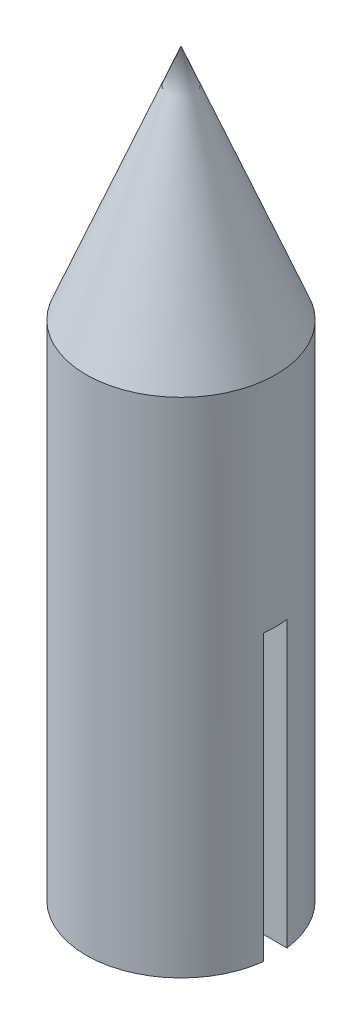
ISO-10303-21;
HEADER;
FILE_DESCRIPTION(('STEP AP214'),'2;1');
FILE_NAME('part.step','',(''),(''),'','','');
FILE_SCHEMA(('AUTOMOTIVE_DESIGN { 1 0 10303 214 1 1 1 1 }'));
ENDSEC;
DATA;
#1=APPLICATION_CONTEXT('core data for automotive mechanical design processes');
#2=APPLICATION_PROTOCOL_DEFINITION('international standard','automotive_design',2000,#1);
#3=PRODUCT_CONTEXT('',#1,'mechanical');
#4=PRODUCT('Part','Part','',(#3));
#5=PRODUCT_RELATED_PRODUCT_CATEGORY('part','',(#4));
#6=PRODUCT_DEFINITION_FORMATION('','',#4);
#7=PRODUCT_DEFINITION_CONTEXT('part definition',#1,'design');
#8=PRODUCT_DEFINITION('design','',#6,#7);
#9=PRODUCT_DEFINITION_SHAPE('','',#8);
#10=(LENGTH_UNIT() NAMED_UNIT(*) SI_UNIT(.MILLI.,.METRE.));
#11=(NAMED_UNIT(*) PLANE_ANGLE_UNIT() SI_UNIT($,.RADIAN.));
#12=(NAMED_UNIT(*) SI_UNIT($,.STERADIAN.) SOLID_ANGLE_UNIT());
#13=UNCERTAINTY_MEASURE_WITH_UNIT(LENGTH_MEASURE(1.E-05),#10,'distance_accuracy_value','');
#14=(GEOMETRIC_REPRESENTATION_CONTEXT(3) GLOBAL_UNCERTAINTY_ASSIGNED_CONTEXT((#13)) GLOBAL_UNIT_ASSIGNED_CONTEXT((#10,
#11,#12)) REPRESENTATION_CONTEXT('',''));
#15=CARTESIAN_POINT('',(0.,0.,0.));
#16=DIRECTION('',(0.,0.,1.));
#17=DIRECTION('',(1.,0.,0.));
#18=AXIS2_PLACEMENT_3D('',#15,#16,#17);
#19=CARTESIAN_POINT('',(0.,0.,0.));
#20=DIRECTION('',(0.,1.,0.));
#21=DIRECTION('',(0.,0.,1.));
#22=AXIS2_PLACEMENT_3D('',#19,#20,#21);
#23=PLANE('',#22);
#24=CARTESIAN_POINT('',(0.,0.,0.));
#25=DIRECTION('',(0.,1.,0.));
#26=DIRECTION('',(0.,0.,1.));
#27=AXIS2_PLACEMENT_3D('',#24,#25,#26);
#28=CIRCLE('',#27,2.54);
#29=CARTESIAN_POINT('',(2.52007812378902,0.,-0.3175));
#30=VERTEX_POINT('',#29);
#31=CARTESIAN_POINT('',(-2.52007812378902,0.,-0.3175));
#32=VERTEX_POINT('',#31);
#33=EDGE_CURVE('E180',#30,#32,#28,.T.);
#34=ORIENTED_EDGE('',*,*,#33,.F.);
#35=DIRECTION('',(1.,0.,0.));
#36=VECTOR('',#35,1.);
#37=CARTESIAN_POINT('',(-2.54,0.,-0.3175));
#38=LINE('',#37,#36);
#39=CARTESIAN_POINT('',(1.22967221242086,0.,-0.3175));
#40=VERTEX_POINT('',#39);
#41=EDGE_CURVE('E213',#40,#30,#38,.T.);
#42=ORIENTED_EDGE('',*,*,#41,.F.);
#43=CARTESIAN_POINT('',(0.,0.,0.));
#44=DIRECTION('',(0.,1.,0.));
#45=DIRECTION('',(0.,0.,1.));
#46=AXIS2_PLACEMENT_3D('',#43,#44,#45);
#47=CIRCLE('',#46,1.27);
#48=CARTESIAN_POINT('',(-1.22967221242086,0.,-0.3175));
#49=VERTEX_POINT('',#48);
#50=EDGE_CURVE('E176',#40,#49,#47,.T.);
#51=ORIENTED_EDGE('',*,*,#50,.T.);
#52=EDGE_CURVE('E126',#32,#49,#38,.T.);
#53=ORIENTED_EDGE('',*,*,#52,.F.);
#54=EDGE_LOOP('',(#34,#42,#51,#53));
#55=FACE_BOUND('',#54,.T.);
#56=ADVANCED_FACE('F47',(#55),#23,.F.);
#57=CARTESIAN_POINT('',(-2.52007812378902,0.,0.3175));
#58=VERTEX_POINT('',#57);
#59=CARTESIAN_POINT('',(2.52007812378902,0.,0.3175));
#60=VERTEX_POINT('',#59);
#61=EDGE_CURVE('E177',#58,#60,#28,.T.);
#62=ORIENTED_EDGE('',*,*,#61,.F.);
#63=DIRECTION('',(1.,0.,0.));
#64=VECTOR('',#63,1.);
#65=CARTESIAN_POINT('',(-2.54,0.,0.3175));
#66=LINE('',#65,#64);
#67=CARTESIAN_POINT('',(-1.22967221242085,0.,0.3175));
#68=VERTEX_POINT('',#67);
#69=EDGE_CURVE('E134',#58,#68,#66,.T.);
#70=ORIENTED_EDGE('',*,*,#69,.T.);
#71=CARTESIAN_POINT('',(1.22967221242085,0.,0.3175));
#72=VERTEX_POINT('',#71);
#73=EDGE_CURVE('E172',#68,#72,#47,.T.);
#74=ORIENTED_EDGE('',*,*,#73,.T.);
#75=EDGE_CURVE('E142',#72,#60,#66,.T.);
#76=ORIENTED_EDGE('',*,*,#75,.T.);
#77=EDGE_LOOP('',(#62,#70,#74,#76));
#78=FACE_BOUND('',#77,.T.);
#79=ADVANCED_FACE('F217',(#78),#23,.F.);
#80=CARTESIAN_POINT('',(0.,11.43,0.));
#81=DIRECTION('',(0.,-1.,0.));
#82=DIRECTION('',(0.,0.,-1.));
#83=AXIS2_PLACEMENT_3D('',#80,#81,#82);
#84=CYLINDRICAL_SURFACE('',#83,2.54);
#85=ORIENTED_EDGE('',*,*,#61,.T.);
#86=DIRECTION('',(0.,-1.,0.));
#87=VECTOR('',#86,1.);
#88=CARTESIAN_POINT('',(2.52007812378902,11.43,0.317500000000007));
#89=LINE('',#88,#87);
#90=CARTESIAN_POINT('',(2.52007812378902,7.62,0.317500000000005));
#91=VERTEX_POINT('',#90);
#92=EDGE_CURVE('E136',#60,#91,#89,.F.);
#93=ORIENTED_EDGE('',*,*,#92,.T.);
#94=CARTESIAN_POINT('',(0.,7.62,0.));
#95=DIRECTION('',(0.,1.,0.));
#96=DIRECTION('',(0.,0.,1.));
#97=AXIS2_PLACEMENT_3D('',#94,#95,#96);
#98=CIRCLE('',#97,2.54);
#99=CARTESIAN_POINT('',(2.52007812378902,7.62,-0.3175));
#100=VERTEX_POINT('',#99);
#101=EDGE_CURVE('E125',#91,#100,#98,.T.);
#102=ORIENTED_EDGE('',*,*,#101,.T.);
#103=DIRECTION('',(0.,-1.,0.));
#104=VECTOR('',#103,1.);
#105=CARTESIAN_POINT('',(2.52007812378902,11.43,-0.3175));
#106=LINE('',#105,#104);
#107=EDGE_CURVE('E160',#100,#30,#106,.T.);
#108=ORIENTED_EDGE('',*,*,#107,.T.);
#109=ORIENTED_EDGE('',*,*,#33,.T.);
#110=DIRECTION('',(0.,-1.,0.));
#111=VECTOR('',#110,1.);
#112=CARTESIAN_POINT('',(-2.52007812378902,11.43,-0.3175));
#113=LINE('',#112,#111);
#114=CARTESIAN_POINT('',(-2.52007812378902,7.62,-0.3175));
#115=VERTEX_POINT('',#114);
#116=EDGE_CURVE('E122',#32,#115,#113,.F.);
#117=ORIENTED_EDGE('',*,*,#116,.T.);
#118=CARTESIAN_POINT('',(-2.52007812378902,7.62,0.317500000000005));
#119=VERTEX_POINT('',#118);
#120=EDGE_CURVE('E115',#115,#119,#98,.T.);
#121=ORIENTED_EDGE('',*,*,#120,.T.);
#122=DIRECTION('',(0.,-1.,0.));
#123=VECTOR('',#122,1.);
#124=CARTESIAN_POINT('',(-2.52007812378902,11.43,0.317500000000007));
#125=LINE('',#124,#123);
#126=EDGE_CURVE('E119',#119,#58,#125,.T.);
#127=ORIENTED_EDGE('',*,*,#126,.T.);
#128=EDGE_LOOP('',(#85,#93,#102,#108,#109,#117,#121,#127));
#129=FACE_BOUND('',#128,.T.);
#130=CARTESIAN_POINT('',(0.,13.462,0.));
#131=DIRECTION('',(0.,1.,0.));
#132=DIRECTION('',(0.,0.,1.));
#133=AXIS2_PLACEMENT_3D('',#130,#131,#132);
#134=CIRCLE('',#133,2.54);
#135=CARTESIAN_POINT('',(0.,13.462,2.54));
#136=VERTEX_POINT('',#135);
#137=EDGE_CURVE('E164',#136,#136,#134,.T.);
#138=ORIENTED_EDGE('',*,*,#137,.F.);
#139=EDGE_LOOP('',(#138));
#140=FACE_BOUND('',#139,.T.);
#141=ADVANCED_FACE('F49',(#129,#140),#84,.T.);
#142=CARTESIAN_POINT('',(0.,11.43,0.));
#143=DIRECTION('',(0.,-1.,0.));
#144=DIRECTION('',(0.,0.,-1.));
#145=AXIS2_PLACEMENT_3D('',#142,#143,#144);
#146=CYLINDRICAL_SURFACE('',#145,1.27);
#147=DIRECTION('',(0.,-1.,0.));
#148=VECTOR('',#147,1.);
#149=CARTESIAN_POINT('',(1.22967221242086,11.43,-0.3175));
#150=LINE('',#149,#148);
#151=CARTESIAN_POINT('',(1.22967221242086,7.62,-0.3175));
#152=VERTEX_POINT('',#151);
#153=EDGE_CURVE('E11',#152,#40,#150,.T.);
#154=ORIENTED_EDGE('',*,*,#153,.F.);
#155=CARTESIAN_POINT('',(0.,7.62,0.));
#156=DIRECTION('',(0.,1.,0.));
#157=DIRECTION('',(0.,0.,1.));
#158=AXIS2_PLACEMENT_3D('',#155,#156,#157);
#159=CIRCLE('',#158,1.27);
#160=CARTESIAN_POINT('',(1.22967221242085,7.62,0.317500000000005));
#161=VERTEX_POINT('',#160);
#162=EDGE_CURVE('E184',#161,#152,#159,.T.);
#163=ORIENTED_EDGE('',*,*,#162,.F.);
#164=DIRECTION('',(0.,-1.,0.));
#165=VECTOR('',#164,1.);
#166=CARTESIAN_POINT('',(1.22967221242085,11.43,0.317500000000007));
#167=LINE('',#166,#165);
#168=EDGE_CURVE('E56',#72,#161,#167,.F.);
#169=ORIENTED_EDGE('',*,*,#168,.F.);
#170=ORIENTED_EDGE('',*,*,#73,.F.);
#171=DIRECTION('',(0.,-1.,0.));
#172=VECTOR('',#171,1.);
#173=CARTESIAN_POINT('',(-1.22967221242085,11.43,0.317500000000007));
#174=LINE('',#173,#172);
#175=CARTESIAN_POINT('',(-1.22967221242085,7.62,0.317500000000005));
#176=VERTEX_POINT('',#175);
#177=EDGE_CURVE('E183',#176,#68,#174,.T.);
#178=ORIENTED_EDGE('',*,*,#177,.F.);
#179=CARTESIAN_POINT('',(-1.22967221242086,7.62,-0.3175));
#180=VERTEX_POINT('',#179);
#181=EDGE_CURVE('E140',#180,#176,#159,.T.);
#182=ORIENTED_EDGE('',*,*,#181,.F.);
#183=DIRECTION('',(0.,-1.,0.));
#184=VECTOR('',#183,1.);
#185=CARTESIAN_POINT('',(-1.22967221242086,11.43,-0.3175));
#186=LINE('',#185,#184);
#187=EDGE_CURVE('E187',#49,#180,#186,.F.);
#188=ORIENTED_EDGE('',*,*,#187,.F.);
#189=ORIENTED_EDGE('',*,*,#50,.F.);
#190=EDGE_LOOP('',(#154,#163,#169,#170,#178,#182,#188,#189));
#191=FACE_BOUND('',#190,.T.);
#192=CARTESIAN_POINT('',(0.,11.43,0.));
#193=DIRECTION('',(0.,1.,0.));
#194=DIRECTION('',(0.,0.,1.));
#195=AXIS2_PLACEMENT_3D('',#192,#193,#194);
#196=CIRCLE('',#195,1.27);
#197=CARTESIAN_POINT('',(0.,11.43,1.27));
#198=VERTEX_POINT('',#197);
#199=EDGE_CURVE('E168',#198,#198,#196,.T.);
#200=ORIENTED_EDGE('',*,*,#199,.T.);
#201=EDGE_LOOP('',(#200));
#202=FACE_BOUND('',#201,.T.);
#203=ADVANCED_FACE('F203',(#191,#202),#146,.F.);
#204=CARTESIAN_POINT('',(0.,11.43,0.));
#205=DIRECTION('',(0.,1.,0.));
#206=DIRECTION('',(0.,0.,1.));
#207=AXIS2_PLACEMENT_3D('',#204,#205,#206);
#208=PLANE('',#207);
#209=ORIENTED_EDGE('',*,*,#199,.F.);
#210=EDGE_LOOP('',(#209));
#211=FACE_BOUND('',#210,.T.);
#212=ADVANCED_FACE('F238',(#211),#208,.F.);
#213=CARTESIAN_POINT('',(0.,19.812,0.));
#214=DIRECTION('',(0.,-1.,0.));
#215=DIRECTION('',(0.,0.,-1.));
#216=AXIS2_PLACEMENT_3D('',#213,#214,#215);
#217=CONICAL_SURFACE('',#216,0.,0.380506377112365);
#218=ORIENTED_EDGE('',*,*,#137,.T.);
#219=EDGE_LOOP('',(#218));
#220=FACE_BOUND('',#219,.T.);
#221=CARTESIAN_POINT('',(0.,19.812,0.));
#222=VERTEX_POINT('',#221);
#223=VERTEX_LOOP('',#222);
#224=FACE_BOUND('',#223,.T.);
#225=ADVANCED_FACE('F241',(#220,#224),#217,.T.);
#226=CARTESIAN_POINT('',(-2.54,7.62,-0.3175));
#227=DIRECTION('',(0.,1.,0.));
#228=DIRECTION('',(0.,0.,1.));
#229=AXIS2_PLACEMENT_3D('',#226,#227,#228);
#230=PLANE('',#229);
#231=DIRECTION('',(1.,0.,0.));
#232=VECTOR('',#231,1.);
#233=CARTESIAN_POINT('',(-2.54,7.62,-0.3175));
#234=LINE('',#233,#232);
#235=EDGE_CURVE('E71',#115,#180,#234,.T.);
#236=ORIENTED_EDGE('',*,*,#235,.T.);
#237=ORIENTED_EDGE('',*,*,#181,.T.);
#238=DIRECTION('',(1.,0.,0.));
#239=VECTOR('',#238,1.);
#240=CARTESIAN_POINT('',(-2.54,7.62,0.317500000000005));
#241=LINE('',#240,#239);
#242=EDGE_CURVE('E131',#119,#176,#241,.T.);
#243=ORIENTED_EDGE('',*,*,#242,.F.);
#244=ORIENTED_EDGE('',*,*,#120,.F.);
#245=EDGE_LOOP('',(#236,#237,#243,#244));
#246=FACE_BOUND('',#245,.T.);
#247=ADVANCED_FACE('F138',(#246),#230,.F.);
#248=CARTESIAN_POINT('',(-2.54,0.,0.3175));
#249=DIRECTION('',(0.,0.,1.));
#250=DIRECTION('',(0.,-1.,0.));
#251=AXIS2_PLACEMENT_3D('',#248,#249,#250);
#252=PLANE('',#251);
#253=ORIENTED_EDGE('',*,*,#242,.T.);
#254=ORIENTED_EDGE('',*,*,#177,.T.);
#255=ORIENTED_EDGE('',*,*,#69,.F.);
#256=ORIENTED_EDGE('',*,*,#126,.F.);
#257=EDGE_LOOP('',(#253,#254,#255,#256));
#258=FACE_BOUND('',#257,.T.);
#259=ADVANCED_FACE('F130',(#258),#252,.F.);
#260=CARTESIAN_POINT('',(-2.54,0.,-0.3175));
#261=DIRECTION('',(0.,0.,-1.));
#262=DIRECTION('',(-1.,0.,0.));
#263=AXIS2_PLACEMENT_3D('',#260,#261,#262);
#264=PLANE('',#263);
#265=ORIENTED_EDGE('',*,*,#52,.T.);
#266=ORIENTED_EDGE('',*,*,#187,.T.);
#267=ORIENTED_EDGE('',*,*,#235,.F.);
#268=ORIENTED_EDGE('',*,*,#116,.F.);
#269=EDGE_LOOP('',(#265,#266,#267,#268));
#270=FACE_BOUND('',#269,.T.);
#271=ADVANCED_FACE('F226',(#270),#264,.F.);
#272=EDGE_CURVE('E150',#152,#100,#234,.T.);
#273=ORIENTED_EDGE('',*,*,#272,.F.);
#274=ORIENTED_EDGE('',*,*,#153,.T.);
#275=ORIENTED_EDGE('',*,*,#41,.T.);
#276=ORIENTED_EDGE('',*,*,#107,.F.);
#277=EDGE_LOOP('',(#273,#274,#275,#276));
#278=FACE_BOUND('',#277,.T.);
#279=ADVANCED_FACE('F200',(#278),#264,.F.);
#280=ORIENTED_EDGE('',*,*,#75,.F.);
#281=ORIENTED_EDGE('',*,*,#168,.T.);
#282=EDGE_CURVE('E63',#161,#91,#241,.T.);
#283=ORIENTED_EDGE('',*,*,#282,.T.);
#284=ORIENTED_EDGE('',*,*,#92,.F.);
#285=EDGE_LOOP('',(#280,#281,#283,#284));
#286=FACE_BOUND('',#285,.T.);
#287=ADVANCED_FACE('F218',(#286),#252,.F.);
#288=ORIENTED_EDGE('',*,*,#282,.F.);
#289=ORIENTED_EDGE('',*,*,#162,.T.);
#290=ORIENTED_EDGE('',*,*,#272,.T.);
#291=ORIENTED_EDGE('',*,*,#101,.F.);
#292=EDGE_LOOP('',(#288,#289,#290,#291));
#293=FACE_BOUND('',#292,.T.);
#294=ADVANCED_FACE('F195',(#293),#230,.F.);
#295=CLOSED_SHELL('',(#56,#79,#141,#203,#212,#225,#247,#259,#271,#279,#287,#294));
#296=MANIFOLD_SOLID_BREP('B2',#295);
#297=ADVANCED_BREP_SHAPE_REPRESENTATION('',(#18,#296),#14);
#298=SHAPE_DEFINITION_REPRESENTATION(#9,#297);
ENDSEC;
END-ISO-10303-21;
